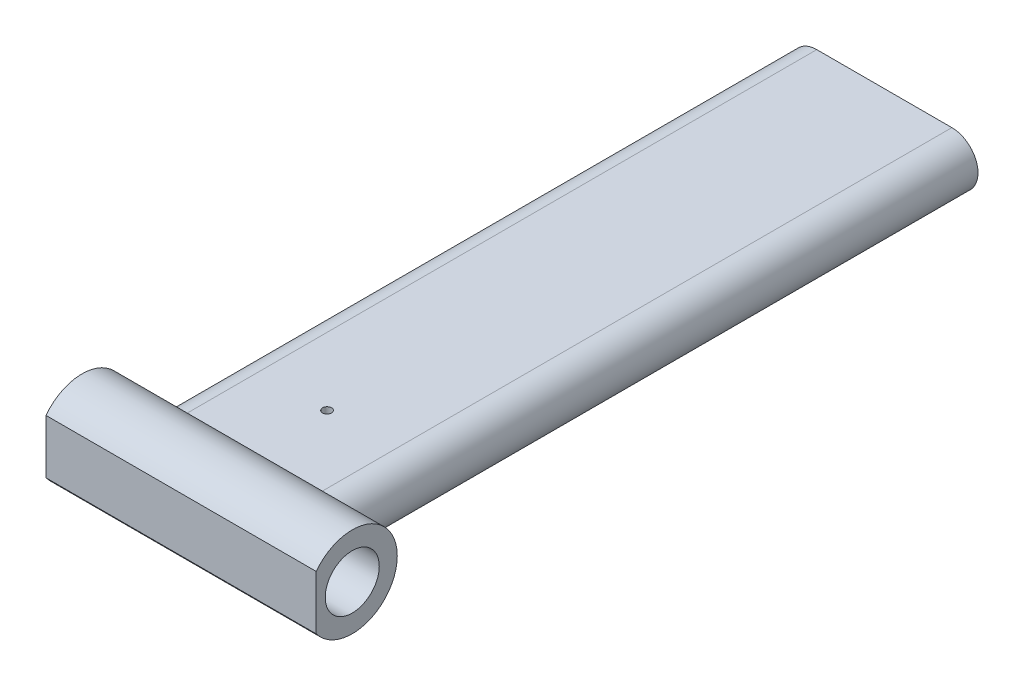
ISO-10303-21;
HEADER;
FILE_DESCRIPTION(('STEP AP214'),'2;1');
FILE_NAME('part.step','',(''),(''),'','','');
FILE_SCHEMA(('AUTOMOTIVE_DESIGN { 1 0 10303 214 1 1 1 1 }'));
ENDSEC;
DATA;
#1=APPLICATION_CONTEXT('core data for automotive mechanical design processes');
#2=APPLICATION_PROTOCOL_DEFINITION('international standard','automotive_design',2000,#1);
#3=PRODUCT_CONTEXT('',#1,'mechanical');
#4=PRODUCT('Part','Part','',(#3));
#5=PRODUCT_RELATED_PRODUCT_CATEGORY('part','',(#4));
#6=PRODUCT_DEFINITION_FORMATION('','',#4);
#7=PRODUCT_DEFINITION_CONTEXT('part definition',#1,'design');
#8=PRODUCT_DEFINITION('design','',#6,#7);
#9=PRODUCT_DEFINITION_SHAPE('','',#8);
#10=(LENGTH_UNIT() NAMED_UNIT(*) SI_UNIT(.MILLI.,.METRE.));
#11=(NAMED_UNIT(*) PLANE_ANGLE_UNIT() SI_UNIT($,.RADIAN.));
#12=(NAMED_UNIT(*) SI_UNIT($,.STERADIAN.) SOLID_ANGLE_UNIT());
#13=UNCERTAINTY_MEASURE_WITH_UNIT(LENGTH_MEASURE(1.E-05),#10,'distance_accuracy_value','');
#14=(GEOMETRIC_REPRESENTATION_CONTEXT(3) GLOBAL_UNCERTAINTY_ASSIGNED_CONTEXT((#13)) GLOBAL_UNIT_ASSIGNED_CONTEXT((#10,
#11,#12)) REPRESENTATION_CONTEXT('',''));
#15=CARTESIAN_POINT('',(0.,0.,0.));
#16=DIRECTION('',(0.,0.,1.));
#17=DIRECTION('',(1.,0.,0.));
#18=AXIS2_PLACEMENT_3D('',#15,#16,#17);
#19=CARTESIAN_POINT('',(7.5,0.,35.));
#20=DIRECTION('',(0.,0.,1.));
#21=DIRECTION('',(1.,0.,0.));
#22=AXIS2_PLACEMENT_3D('',#19,#20,#21);
#23=PLANE('',#22);
#24=CARTESIAN_POINT('',(7.5,0.,35.));
#25=DIRECTION('',(0.,0.,1.));
#26=DIRECTION('',(1.,0.,0.));
#27=AXIS2_PLACEMENT_3D('',#24,#25,#26);
#28=CIRCLE('',#27,2.9);
#29=CARTESIAN_POINT('',(7.5,-2.9,35.));
#30=VERTEX_POINT('',#29);
#31=CARTESIAN_POINT('',(7.79725742015153,-2.88472494809555,35.));
#32=VERTEX_POINT('',#31);
#33=EDGE_CURVE('E271',#30,#32,#28,.T.);
#34=ORIENTED_EDGE('',*,*,#33,.T.);
#35=DIRECTION('',(-1.,0.,0.));
#36=VECTOR('',#35,1.);
#37=CARTESIAN_POINT('',(15.,-2.88472494809555,35.));
#38=LINE('',#37,#36);
#39=CARTESIAN_POINT('',(-7.79725742015153,-2.88472494809555,35.));
#40=VERTEX_POINT('',#39);
#41=EDGE_CURVE('E246',#32,#40,#38,.T.);
#42=ORIENTED_EDGE('',*,*,#41,.T.);
#43=CARTESIAN_POINT('',(-7.5,0.,35.));
#44=DIRECTION('',(0.,0.,1.));
#45=DIRECTION('',(1.,0.,0.));
#46=AXIS2_PLACEMENT_3D('',#43,#44,#45);
#47=CIRCLE('',#46,2.9);
#48=CARTESIAN_POINT('',(-7.5,-2.9,35.));
#49=VERTEX_POINT('',#48);
#50=EDGE_CURVE('E274',#40,#49,#47,.T.);
#51=ORIENTED_EDGE('',*,*,#50,.T.);
#52=DIRECTION('',(1.,0.,0.));
#53=VECTOR('',#52,1.);
#54=CARTESIAN_POINT('',(7.5,-2.9,35.));
#55=LINE('',#54,#53);
#56=EDGE_CURVE('E278',#49,#30,#55,.T.);
#57=ORIENTED_EDGE('',*,*,#56,.T.);
#58=EDGE_LOOP('',(#34,#42,#51,#57));
#59=FACE_BOUND('',#58,.T.);
#60=ADVANCED_FACE('F45',(#59),#23,.T.);
#61=CARTESIAN_POINT('',(7.5,0.,35.));
#62=DIRECTION('',(0.,0.,-1.));
#63=DIRECTION('',(-1.,0.,0.));
#64=AXIS2_PLACEMENT_3D('',#61,#62,#63);
#65=CYLINDRICAL_SURFACE('',#64,2.9);
#66=CARTESIAN_POINT('',(4.6,0.,34.0731057036588));
#67=CARTESIAN_POINT('',(4.60000859308253,-0.149323091804453,34.0735696613463));
#68=CARTESIAN_POINT('',(4.61161208448263,-0.298860096263019,34.0807812520985));
#69=CARTESIAN_POINT('',(4.65743231106752,-0.59341131911271,34.1080544837705));
#70=CARTESIAN_POINT('',(4.69170343800221,-0.73841377807614,34.1281470293976));
#71=CARTESIAN_POINT('',(4.78096790044871,-1.01903846124212,34.1791637112473));
#72=CARTESIAN_POINT('',(4.83586172173789,-1.15470208796062,34.2100357814763));
#73=CARTESIAN_POINT('',(4.96421348664588,-1.41449664900542,34.2799751735939));
#74=CARTESIAN_POINT('',(5.03766707782475,-1.53863027790314,34.3190405737053));
#75=CARTESIAN_POINT('',(5.2071536046435,-1.78227073257131,34.405454431006));
#76=CARTESIAN_POINT('',(5.30445889076254,-1.90074810281223,34.453202702729));
#77=CARTESIAN_POINT('',(5.51605921210326,-2.12068586327357,34.5506742951925));
#78=CARTESIAN_POINT('',(5.63037486660659,-2.22212527860831,34.6003999584865));
#79=CARTESIAN_POINT('',(5.88802442749597,-2.41670612576128,34.7028574098811));
#80=CARTESIAN_POINT('',(6.03317778067608,-2.50761381092249,34.7552937335761));
#81=CARTESIAN_POINT('',(6.33980914612007,-2.66334380260292,34.8501264672196));
#82=CARTESIAN_POINT('',(6.50126075807103,-2.72820747359309,34.8925387534368));
#83=CARTESIAN_POINT('',(6.79781180542367,-2.81692280380674,34.9523022114851));
#84=CARTESIAN_POINT('',(6.93040213066588,-2.84678273734841,34.9731772039438));
#85=CARTESIAN_POINT('',(7.19978096175157,-2.887623827329,35.0019854849622));
#86=CARTESIAN_POINT('',(7.33656454603734,-2.89862631340679,35.0099333948113));
#87=CARTESIAN_POINT('',(7.6106131955965,-2.90113315244795,35.0117319576496));
#88=CARTESIAN_POINT('',(7.74787867760975,-2.89260756270609,35.0055609619157));
#89=CARTESIAN_POINT('',(8.01864881087647,-2.8565172094846,34.9800058670248));
#90=CARTESIAN_POINT('',(8.1521506996857,-2.82893882159934,34.96061231272));
#91=CARTESIAN_POINT('',(8.41128218757327,-2.75637030539624,34.9113681478763));
#92=CARTESIAN_POINT('',(8.53695549686073,-2.71148928659073,34.8815831747859));
#93=CARTESIAN_POINT('',(8.77935819558176,-2.60590583661322,34.8147601568606));
#94=CARTESIAN_POINT('',(8.89608419328327,-2.54519744363254,34.7777193802412));
#95=CARTESIAN_POINT('',(9.1379163955927,-2.39801121591817,34.693084445942));
#96=CARTESIAN_POINT('',(9.26118288440367,-2.30892590402053,34.6447599521899));
#97=CARTESIAN_POINT('',(9.49222166200274,-2.11283329227971,34.5472469850994));
#98=CARTESIAN_POINT('',(9.59997993110885,-2.00580996299756,34.4980577745555));
#99=CARTESIAN_POINT('',(9.81044288244475,-1.76095334873572,34.3971271056267));
#100=CARTESIAN_POINT('',(9.91087813830147,-1.6209471390896,34.3458212218614));
#101=CARTESIAN_POINT('',(10.0424625048596,-1.39763281877958,34.2762273174069));
#102=CARTESIAN_POINT('',(10.0831587243201,-1.32094282145287,34.2542492903374));
#103=CARTESIAN_POINT('',(10.1577590850894,-1.16356528508404,34.2133575928731));
#104=CARTESIAN_POINT('',(10.1916673594155,-1.08288021610812,34.1944420591496));
#105=CARTESIAN_POINT('',(10.2502322890893,-0.923549846415607,34.161383452438));
#106=CARTESIAN_POINT('',(10.275352795785,-0.845123101710534,34.1470073410511));
#107=CARTESIAN_POINT('',(10.3189228899643,-0.685915616006453,34.1218379082512));
#108=CARTESIAN_POINT('',(10.3373761224184,-0.605136187392592,34.1110426294776));
#109=CARTESIAN_POINT('',(10.36732992167,-0.441921100764522,34.0933535403335));
#110=CARTESIAN_POINT('',(10.3788348609093,-0.359486518131282,34.0864572765544));
#111=CARTESIAN_POINT('',(10.3947218868228,-0.193724542646152,34.0767608612005));
#112=CARTESIAN_POINT('',(10.3991048458465,-0.110397260397045,34.0739602079711));
#113=CARTESIAN_POINT('',(10.4012173306716,0.118561464705537,34.0720408513326));
#114=CARTESIAN_POINT('',(10.3915630507954,0.26438729636668,34.0772162645918));
#115=CARTESIAN_POINT('',(10.3507085599155,0.551894976747795,34.099865020829));
#116=CARTESIAN_POINT('',(10.3195083271729,0.693576821286534,34.1173383762149));
#117=CARTESIAN_POINT('',(10.2377140937705,0.966930344027687,34.1625583461787));
#118=CARTESIAN_POINT('',(10.1874356424124,1.09872517627305,34.1901375699809));
#119=CARTESIAN_POINT('',(10.0693310008068,1.35207152478134,34.2533261858201));
#120=CARTESIAN_POINT('',(10.0015008686782,1.47362073186866,34.2889373815035));
#121=CARTESIAN_POINT('',(9.84235756189763,1.71655782235697,34.3695034723072));
#122=CARTESIAN_POINT('',(9.74934371927057,1.83663552646443,34.4150432905971));
#123=CARTESIAN_POINT('',(9.54635082249472,2.06041572737082,34.5088566021297));
#124=CARTESIAN_POINT('',(9.43635237128592,2.16409922386101,34.5571331804538));
#125=CARTESIAN_POINT('',(9.18740375107453,2.36455461530603,34.6577823384035));
#126=CARTESIAN_POINT('',(9.04657185976775,2.45909716737563,34.7099729774203));
#127=CARTESIAN_POINT('',(8.74838632485985,2.6230489284415,34.8059323320956));
#128=CARTESIAN_POINT('',(8.59105326108224,2.69248897484832,34.8497113498865));
#129=CARTESIAN_POINT('',(8.29806452914012,2.79135747590465,34.9142254397461));
#130=CARTESIAN_POINT('',(8.16486302725833,2.82614242713288,34.9378760805921));
#131=CARTESIAN_POINT('',(7.89333593928654,2.87650740073892,34.9725564745115));
#132=CARTESIAN_POINT('',(7.75501673093741,2.89211054898593,34.983601424042));
#133=CARTESIAN_POINT('',(7.47680669164244,2.90325466827398,34.9914613874488));
#134=CARTESIAN_POINT('',(7.33691281874565,2.89874590173038,34.9882411230055));
#135=CARTESIAN_POINT('',(7.06019019556588,2.86983410127894,34.9679899895701));
#136=CARTESIAN_POINT('',(6.92336336761533,2.84541893014613,34.9509506949476));
#137=CARTESIAN_POINT('',(6.65993507684479,2.77890042271308,34.9060796916662));
#138=CARTESIAN_POINT('',(6.53316009294009,2.73727443958108,34.8785406933952));
#139=CARTESIAN_POINT('',(6.28814329364046,2.63797263209702,34.8157476691018));
#140=CARTESIAN_POINT('',(6.1699045723943,2.58029102446425,34.7804908640831));
#141=CARTESIAN_POINT('',(5.92600457920412,2.44033211735418,34.6996887317621));
#142=CARTESIAN_POINT('',(5.8019766806283,2.35564166254766,34.6533946075577));
#143=CARTESIAN_POINT('',(5.56868185880743,2.16850252184747,34.5592594983409));
#144=CARTESIAN_POINT('',(5.45942841512725,2.06603781144471,34.5114171494514));
#145=CARTESIAN_POINT('',(5.24393180244646,1.83002240631621,34.4120535492227));
#146=CARTESIAN_POINT('',(5.14004353301485,1.69414720640136,34.3608954867008));
#147=CARTESIAN_POINT('',(4.9567427563496,1.40399665629996,34.2673982419464));
#148=CARTESIAN_POINT('',(4.87731634428883,1.24973182874342,34.2250540541066));
#149=CARTESIAN_POINT('',(4.75823595220839,0.955637123511464,34.1604237047045));
#150=CARTESIAN_POINT('',(4.71401577797432,0.818137022695345,34.1359074405293));
#151=CARTESIAN_POINT('',(4.64646767603986,0.536799758690869,34.0983452460405));
#152=CARTESIAN_POINT('',(4.6230819863701,0.392981283197655,34.0852676048932));
#153=CARTESIAN_POINT('',(4.6070920960275,0.206903229121089,34.0765834204131));
#154=CARTESIAN_POINT('',(4.60443537743237,0.165587676294961,34.0751710744771));
#155=CARTESIAN_POINT('',(4.60088801885187,0.0828535813229103,34.0733677768442));
#156=CARTESIAN_POINT('',(4.59999761554228,0.0414350261196555,34.0729769620243));
#157=CARTESIAN_POINT('',(4.6,0.,34.0731057036588));
#158=B_SPLINE_CURVE_WITH_KNOTS('',3,(#66,#67,#68,#69,#70,#71,#72,#73,#74,#75,#76,#77,#78,#79,
#80,#81,#82,#83,#84,#85,#86,#87,#88,#89,#90,#91,#92,#93,#94,#95,#96,#97,#98,#99,#100,#101,#102,
#103,#104,#105,#106,#107,#108,#109,#110,#111,#112,#113,#114,#115,#116,#117,#118,#119,#120,#121,
#122,#123,#124,#125,#126,#127,#128,#129,#130,#131,#132,#133,#134,#135,#136,#137,#138,#139,#140,
#141,#142,#143,#144,#145,#146,#147,#148,#149,#150,#151,#152,#153,#154,#155,#156,#157),
.UNSPECIFIED.,.T.,.F.,(4,2,2,2,2,2,2,2,2,2,2,2,2,2,2,2,2,2,2,2,2,2,2,2,2,2,2,2,2,2,2,2,2,2,2,2,
2,2,2,2,2,2,2,2,2,4),(0.,0.447797326337698,0.896673074521697,1.3434100414022,1.79004234135358,
2.2698672717759,2.75027863741921,3.284988712723,3.81884614179468,4.22959035493267,
4.63986966836597,5.05077849055113,5.46198145278928,5.87063271908302,6.27943813789043,
6.75629776408863,7.23358580708956,7.76984532737279,8.03819660919938,8.30638399803649,
8.5568176549017,8.80711419284568,9.05725305890729,9.30736128391772,9.7436928637086,
10.1800248837377,10.6094341937915,11.0389400274693,11.5127538910793,11.9871129256802,
12.5169926913495,13.0462192912426,13.4635018058645,13.8802807434964,14.2980909630846,
14.7161561183234,15.1233304939298,15.5306517251004,16.0003097213041,16.4703933628746,
17.0033190929159,17.5359413310599,17.9736060524001,18.4100535724231,18.5342942909719,
18.6585516559173),.UNSPECIFIED.);
#159=CARTESIAN_POINT('',(7.5,2.9,34.9891673406904));
#160=VERTEX_POINT('',#159);
#161=EDGE_CURVE('E70',#32,#160,#158,.T.);
#162=ORIENTED_EDGE('',*,*,#161,.F.);
#163=ORIENTED_EDGE('',*,*,#33,.F.);
#164=DIRECTION('',(0.,0.,-1.));
#165=VECTOR('',#164,1.);
#166=CARTESIAN_POINT('',(7.5,-2.9,35.));
#167=LINE('',#166,#165);
#168=CARTESIAN_POINT('',(7.5,-2.9,-35.));
#169=VERTEX_POINT('',#168);
#170=EDGE_CURVE('E281',#30,#169,#167,.T.);
#171=ORIENTED_EDGE('',*,*,#170,.T.);
#172=CARTESIAN_POINT('',(7.5,0.,-35.));
#173=DIRECTION('',(0.,0.,1.));
#174=DIRECTION('',(1.,0.,0.));
#175=AXIS2_PLACEMENT_3D('',#172,#173,#174);
#176=CIRCLE('',#175,2.9);
#177=CARTESIAN_POINT('',(7.5,2.9,-35.));
#178=VERTEX_POINT('',#177);
#179=EDGE_CURVE('E232',#169,#178,#176,.T.);
#180=ORIENTED_EDGE('',*,*,#179,.T.);
#181=DIRECTION('',(0.,0.,-1.));
#182=VECTOR('',#181,1.);
#183=CARTESIAN_POINT('',(7.5,2.9,35.));
#184=LINE('',#183,#182);
#185=EDGE_CURVE('E303',#160,#178,#184,.T.);
#186=ORIENTED_EDGE('',*,*,#185,.F.);
#187=EDGE_LOOP('',(#162,#163,#171,#180,#186));
#188=FACE_BOUND('',#187,.T.);
#189=ADVANCED_FACE('F47',(#188),#65,.T.);
#190=CARTESIAN_POINT('',(7.5,2.9,35.));
#191=DIRECTION('',(0.,-1.,0.));
#192=DIRECTION('',(1.,0.,0.));
#193=AXIS2_PLACEMENT_3D('',#190,#191,#192);
#194=PLANE('',#193);
#195=CARTESIAN_POINT('',(0.,2.9,26.8701622728494));
#196=DIRECTION('',(0.,1.,0.));
#197=DIRECTION('',(-1.,0.,0.));
#198=AXIS2_PLACEMENT_3D('',#195,#196,#197);
#199=CIRCLE('',#198,0.5);
#200=CARTESIAN_POINT('',(-0.5,2.9,26.8701622728494));
#201=VERTEX_POINT('',#200);
#202=EDGE_CURVE('E367',#201,#201,#199,.T.);
#203=ORIENTED_EDGE('',*,*,#202,.F.);
#204=EDGE_LOOP('',(#203));
#205=FACE_BOUND('',#204,.T.);
#206=DIRECTION('',(-1.,0.,0.));
#207=VECTOR('',#206,1.);
#208=CARTESIAN_POINT('',(15.,2.9,34.9891673406904));
#209=LINE('',#208,#207);
#210=CARTESIAN_POINT('',(-7.5,2.9,34.9891673406904));
#211=VERTEX_POINT('',#210);
#212=EDGE_CURVE('E194',#160,#211,#209,.T.);
#213=ORIENTED_EDGE('',*,*,#212,.F.);
#214=ORIENTED_EDGE('',*,*,#185,.T.);
#215=DIRECTION('',(-1.,0.,0.));
#216=VECTOR('',#215,1.);
#217=CARTESIAN_POINT('',(7.5,2.9,-35.));
#218=LINE('',#217,#216);
#219=CARTESIAN_POINT('',(-7.5,2.9,-35.));
#220=VERTEX_POINT('',#219);
#221=EDGE_CURVE('E284',#178,#220,#218,.T.);
#222=ORIENTED_EDGE('',*,*,#221,.T.);
#223=DIRECTION('',(0.,0.,-1.));
#224=VECTOR('',#223,1.);
#225=CARTESIAN_POINT('',(-7.5,2.9,35.));
#226=LINE('',#225,#224);
#227=EDGE_CURVE('E300',#211,#220,#226,.T.);
#228=ORIENTED_EDGE('',*,*,#227,.F.);
#229=EDGE_LOOP('',(#213,#214,#222,#228));
#230=FACE_BOUND('',#229,.T.);
#231=ADVANCED_FACE('F200',(#205,#230),#194,.F.);
#232=CARTESIAN_POINT('',(-7.5,0.,35.));
#233=DIRECTION('',(0.,0.,-1.));
#234=DIRECTION('',(-1.,0.,0.));
#235=AXIS2_PLACEMENT_3D('',#232,#233,#234);
#236=CYLINDRICAL_SURFACE('',#235,2.9);
#237=CARTESIAN_POINT('',(-10.4,0.,34.0731057036588));
#238=CARTESIAN_POINT('',(-10.3999914069175,-0.149323091804453,34.0735696613463));
#239=CARTESIAN_POINT('',(-10.3883879155174,-0.298860096263019,34.0807812520985));
#240=CARTESIAN_POINT('',(-10.3425676889325,-0.593411319112711,34.1080544837705));
#241=CARTESIAN_POINT('',(-10.3082965619978,-0.73841377807614,34.1281470293976));
#242=CARTESIAN_POINT('',(-10.2190320995513,-1.01903846124212,34.1791637112473));
#243=CARTESIAN_POINT('',(-10.1641382782621,-1.15470208796062,34.2100357814763));
#244=CARTESIAN_POINT('',(-10.0357865133541,-1.41449664900542,34.2799751735939));
#245=CARTESIAN_POINT('',(-9.96233292217525,-1.53863027790314,34.3190405737053));
#246=CARTESIAN_POINT('',(-9.7928463953565,-1.78227073257131,34.405454431006));
#247=CARTESIAN_POINT('',(-9.69554110923746,-1.90074810281223,34.453202702729));
#248=CARTESIAN_POINT('',(-9.48394078789674,-2.12068586327357,34.5506742951925));
#249=CARTESIAN_POINT('',(-9.36962513339341,-2.22212527860831,34.6003999584865));
#250=CARTESIAN_POINT('',(-9.11197557250403,-2.41670612576128,34.7028574098811));
#251=CARTESIAN_POINT('',(-8.96682221932392,-2.50761381092249,34.7552937335761));
#252=CARTESIAN_POINT('',(-8.66019085387994,-2.66334380260292,34.8501264672196));
#253=CARTESIAN_POINT('',(-8.49873924192897,-2.72820747359309,34.8925387534368));
#254=CARTESIAN_POINT('',(-8.20218819457633,-2.81692280380674,34.9523022114851));
#255=CARTESIAN_POINT('',(-8.06959786933412,-2.84678273734841,34.9731772039438));
#256=CARTESIAN_POINT('',(-7.80021903824844,-2.887623827329,35.0019854849622));
#257=CARTESIAN_POINT('',(-7.66343545396267,-2.89862631340679,35.0099333948113));
#258=CARTESIAN_POINT('',(-7.3893868044035,-2.90113315244795,35.0117319576496));
#259=CARTESIAN_POINT('',(-7.25212132239025,-2.89260756270609,35.0055609619157));
#260=CARTESIAN_POINT('',(-6.98135118912353,-2.8565172094846,34.9800058670248));
#261=CARTESIAN_POINT('',(-6.8478493003143,-2.82893882159934,34.96061231272));
#262=CARTESIAN_POINT('',(-6.58871781242673,-2.75637030539624,34.9113681478763));
#263=CARTESIAN_POINT('',(-6.46304450313927,-2.71148928659073,34.8815831747859));
#264=CARTESIAN_POINT('',(-6.22064180441823,-2.60590583661322,34.8147601568606));
#265=CARTESIAN_POINT('',(-6.10391580671674,-2.54519744363254,34.7777193802412));
#266=CARTESIAN_POINT('',(-5.8620836044073,-2.39801121591817,34.693084445942));
#267=CARTESIAN_POINT('',(-5.73881711559633,-2.30892590402053,34.6447599521899));
#268=CARTESIAN_POINT('',(-5.50777833799726,-2.11283329227971,34.5472469850994));
#269=CARTESIAN_POINT('',(-5.40002006889115,-2.00580996299757,34.4980577745555));
#270=CARTESIAN_POINT('',(-5.18955711755525,-1.76095334873572,34.3971271056267));
#271=CARTESIAN_POINT('',(-5.08912186169853,-1.62094713908961,34.3458212218614));
#272=CARTESIAN_POINT('',(-4.9575374951404,-1.39763281877959,34.2762273174069));
#273=CARTESIAN_POINT('',(-4.91684127567995,-1.32094282145288,34.2542492903374));
#274=CARTESIAN_POINT('',(-4.84224091491061,-1.16356528508405,34.2133575928731));
#275=CARTESIAN_POINT('',(-4.80833264058451,-1.08288021610812,34.1944420591496));
#276=CARTESIAN_POINT('',(-4.74976771091067,-0.923549846415608,34.161383452438));
#277=CARTESIAN_POINT('',(-4.72464720421496,-0.845123101710536,34.1470073410511));
#278=CARTESIAN_POINT('',(-4.6810771100357,-0.685915616006455,34.1218379082512));
#279=CARTESIAN_POINT('',(-4.66262387758163,-0.605136187392594,34.1110426294776));
#280=CARTESIAN_POINT('',(-4.63267007833,-0.441921100764525,34.0933535403335));
#281=CARTESIAN_POINT('',(-4.62116513909068,-0.359486518131284,34.0864572765544));
#282=CARTESIAN_POINT('',(-4.60527811317716,-0.193724542646153,34.0767608612005));
#283=CARTESIAN_POINT('',(-4.60089515415349,-0.110397260397046,34.0739602079711));
#284=CARTESIAN_POINT('',(-4.59878266932838,0.118561464705537,34.0720408513326));
#285=CARTESIAN_POINT('',(-4.6084369492046,0.26438729636668,34.0772162645918));
#286=CARTESIAN_POINT('',(-4.64929144008455,0.551894976747796,34.099865020829));
#287=CARTESIAN_POINT('',(-4.6804916728271,0.693576821286534,34.1173383762149));
#288=CARTESIAN_POINT('',(-4.76228590622953,0.966930344027686,34.1625583461787));
#289=CARTESIAN_POINT('',(-4.81256435758761,1.09872517627305,34.1901375699809));
#290=CARTESIAN_POINT('',(-4.93066899919318,1.35207152478134,34.2533261858201));
#291=CARTESIAN_POINT('',(-4.99849913132183,1.47362073186866,34.2889373815035));
#292=CARTESIAN_POINT('',(-5.15764243810237,1.71655782235697,34.3695034723072));
#293=CARTESIAN_POINT('',(-5.25065628072943,1.83663552646442,34.4150432905971));
#294=CARTESIAN_POINT('',(-5.45364917750528,2.06041572737082,34.5088566021297));
#295=CARTESIAN_POINT('',(-5.56364762871408,2.16409922386101,34.5571331804538));
#296=CARTESIAN_POINT('',(-5.81259624892547,2.36455461530603,34.6577823384035));
#297=CARTESIAN_POINT('',(-5.95342814023225,2.45909716737563,34.7099729774203));
#298=CARTESIAN_POINT('',(-6.25161367514015,2.6230489284415,34.8059323320956));
#299=CARTESIAN_POINT('',(-6.40894673891776,2.69248897484832,34.8497113498865));
#300=CARTESIAN_POINT('',(-6.70193547085988,2.79135747590465,34.9142254397461));
#301=CARTESIAN_POINT('',(-6.83513697274167,2.82614242713288,34.9378760805921));
#302=CARTESIAN_POINT('',(-7.10666406071346,2.87650740073892,34.9725564745115));
#303=CARTESIAN_POINT('',(-7.24498326906259,2.89211054898593,34.983601424042));
#304=CARTESIAN_POINT('',(-7.52319330835756,2.90325466827398,34.9914613874488));
#305=CARTESIAN_POINT('',(-7.66308718125435,2.89874590173038,34.9882411230055));
#306=CARTESIAN_POINT('',(-7.93980980443412,2.86983410127894,34.9679899895701));
#307=CARTESIAN_POINT('',(-8.07663663238467,2.84541893014613,34.9509506949476));
#308=CARTESIAN_POINT('',(-8.34006492315521,2.77890042271308,34.9060796916662));
#309=CARTESIAN_POINT('',(-8.46683990705991,2.73727443958108,34.8785406933952));
#310=CARTESIAN_POINT('',(-8.71185670635953,2.63797263209702,34.8157476691018));
#311=CARTESIAN_POINT('',(-8.83009542760569,2.58029102446425,34.7804908640831));
#312=CARTESIAN_POINT('',(-9.07399542079587,2.44033211735418,34.6996887317621));
#313=CARTESIAN_POINT('',(-9.1980233193717,2.35564166254766,34.6533946075577));
#314=CARTESIAN_POINT('',(-9.43131814119258,2.16850252184747,34.5592594983409));
#315=CARTESIAN_POINT('',(-9.54057158487275,2.06603781144471,34.5114171494514));
#316=CARTESIAN_POINT('',(-9.75606819755354,1.83002240631622,34.4120535492227));
#317=CARTESIAN_POINT('',(-9.85995646698515,1.69414720640136,34.3608954867008));
#318=CARTESIAN_POINT('',(-10.0432572436504,1.40399665629996,34.2673982419464));
#319=CARTESIAN_POINT('',(-10.1226836557112,1.24973182874342,34.2250540541066));
#320=CARTESIAN_POINT('',(-10.2417640477916,0.955637123511467,34.1604237047045));
#321=CARTESIAN_POINT('',(-10.2859842220257,0.818137022695348,34.1359074405293));
#322=CARTESIAN_POINT('',(-10.3535323239601,0.536799758690872,34.0983452460405));
#323=CARTESIAN_POINT('',(-10.3769180136299,0.392981283197659,34.0852676048932));
#324=CARTESIAN_POINT('',(-10.3929079039725,0.206903229121093,34.0765834204131));
#325=CARTESIAN_POINT('',(-10.3955646225676,0.165587676294965,34.0751710744771));
#326=CARTESIAN_POINT('',(-10.3991119811481,0.0828535813229129,34.0733677768442));
#327=CARTESIAN_POINT('',(-10.4000023844577,0.0414350261196569,34.0729769620243));
#328=CARTESIAN_POINT('',(-10.4,0.,34.0731057036588));
#329=B_SPLINE_CURVE_WITH_KNOTS('',3,(#237,#238,#239,#240,#241,#242,#243,#244,#245,#246,#247,
#248,#249,#250,#251,#252,#253,#254,#255,#256,#257,#258,#259,#260,#261,#262,#263,#264,#265,#266,
#267,#268,#269,#270,#271,#272,#273,#274,#275,#276,#277,#278,#279,#280,#281,#282,#283,#284,#285,
#286,#287,#288,#289,#290,#291,#292,#293,#294,#295,#296,#297,#298,#299,#300,#301,#302,#303,#304,
#305,#306,#307,#308,#309,#310,#311,#312,#313,#314,#315,#316,#317,#318,#319,#320,#321,#322,#323,
#324,#325,#326,#327,#328),.UNSPECIFIED.,.T.,.F.,(4,2,2,2,2,2,2,2,2,2,2,2,2,2,2,2,2,2,2,2,2,2,2,
2,2,2,2,2,2,2,2,2,2,2,2,2,2,2,2,2,2,2,2,2,2,4),(0.,0.447797326337698,0.896673074521697,
1.34341004140219,1.79004234135358,2.2698672717759,2.75027863741921,3.284988712723,
3.81884614179468,4.22959035493267,4.63986966836597,5.05077849055113,5.46198145278927,
5.87063271908302,6.27943813789043,6.75629776408863,7.23358580708956,7.76984532737279,
8.03819660919937,8.30638399803649,8.5568176549017,8.80711419284568,9.05725305890729,
9.30736128391771,9.7436928637086,10.1800248837377,10.6094341937915,11.0389400274693,
11.5127538910793,11.9871129256802,12.5169926913495,13.0462192912426,13.4635018058645,
13.8802807434964,14.2980909630846,14.7161561183234,15.1233304939298,15.5306517251004,
16.0003097213041,16.4703933628746,17.0033190929159,17.5359413310598,17.9736060524001,
18.410053572423,18.5342942909719,18.6585516559173),.UNSPECIFIED.);
#330=EDGE_CURVE('E186',#211,#40,#329,.T.);
#331=ORIENTED_EDGE('',*,*,#330,.F.);
#332=ORIENTED_EDGE('',*,*,#227,.T.);
#333=CARTESIAN_POINT('',(-7.5,0.,-35.));
#334=DIRECTION('',(0.,0.,1.));
#335=DIRECTION('',(1.,0.,0.));
#336=AXIS2_PLACEMENT_3D('',#333,#334,#335);
#337=CIRCLE('',#336,2.9);
#338=CARTESIAN_POINT('',(-7.5,-2.9,-35.));
#339=VERTEX_POINT('',#338);
#340=EDGE_CURVE('E288',#220,#339,#337,.T.);
#341=ORIENTED_EDGE('',*,*,#340,.T.);
#342=DIRECTION('',(0.,0.,-1.));
#343=VECTOR('',#342,1.);
#344=CARTESIAN_POINT('',(-7.5,-2.9,35.));
#345=LINE('',#344,#343);
#346=EDGE_CURVE('E296',#49,#339,#345,.T.);
#347=ORIENTED_EDGE('',*,*,#346,.F.);
#348=ORIENTED_EDGE('',*,*,#50,.F.);
#349=EDGE_LOOP('',(#331,#332,#341,#347,#348));
#350=FACE_BOUND('',#349,.T.);
#351=ADVANCED_FACE('F195',(#350),#236,.T.);
#352=CARTESIAN_POINT('',(7.5,0.,35.));
#353=DIRECTION('',(0.,0.,-1.));
#354=DIRECTION('',(-1.,0.,0.));
#355=AXIS2_PLACEMENT_3D('',#352,#353,#354);
#356=CYLINDRICAL_SURFACE('',#355,1.9);
#357=DIRECTION('',(0.,0.,-1.));
#358=VECTOR('',#357,1.);
#359=CARTESIAN_POINT('',(7.5,-1.9,35.));
#360=LINE('',#359,#358);
#361=CARTESIAN_POINT('',(7.5,-1.9,34.4544547093855));
#362=VERTEX_POINT('',#361);
#363=CARTESIAN_POINT('',(7.5,-1.9,-35.));
#364=VERTEX_POINT('',#363);
#365=EDGE_CURVE('E259',#362,#364,#360,.T.);
#366=ORIENTED_EDGE('',*,*,#365,.F.);
#367=CARTESIAN_POINT('',(5.6,0.,34.0731057036588));
#368=CARTESIAN_POINT('',(5.59999592598985,-0.102867070264451,34.0734168956019));
#369=CARTESIAN_POINT('',(5.60837994721177,-0.205696668751725,34.0769361105814));
#370=CARTESIAN_POINT('',(5.64154527936848,-0.408257071486904,34.0900195043593));
#371=CARTESIAN_POINT('',(5.66632390305004,-0.507988380773688,34.0995826924736));
#372=CARTESIAN_POINT('',(5.73126389382428,-0.701402512188467,34.12375249778));
#373=CARTESIAN_POINT('',(5.77139462634517,-0.795096948400307,34.1383490653646));
#374=CARTESIAN_POINT('',(5.86574160069643,-0.974407854696053,34.1711596216486));
#375=CARTESIAN_POINT('',(5.91996171739593,-1.06002209371655,34.1893746051613));
#376=CARTESIAN_POINT('',(6.04343847300517,-1.22450797290557,34.2284596005888));
#377=CARTESIAN_POINT('',(6.11320606878204,-1.30297767368042,34.2494062481296));
#378=CARTESIAN_POINT('',(6.26471337187252,-1.44742112346305,34.2912224222745));
#379=CARTESIAN_POINT('',(6.34645690954783,-1.51339085896715,34.312091922006));
#380=CARTESIAN_POINT('',(6.52350025783369,-1.63350188404337,34.352308027886));
#381=CARTESIAN_POINT('',(6.61920522843817,-1.68707963631558,34.3715631481311));
#382=CARTESIAN_POINT('',(6.81912585928198,-1.77719376789458,34.4051721208582));
#383=CARTESIAN_POINT('',(6.92333788671393,-1.8137373770959,34.4195280520356));
#384=CARTESIAN_POINT('',(7.13260687203539,-1.86712970928307,34.440874294756));
#385=CARTESIAN_POINT('',(7.23743399720057,-1.88475911338819,34.448155291331));
#386=CARTESIAN_POINT('',(7.4487921906245,-1.9022642564986,34.4553835916863));
#387=CARTESIAN_POINT('',(7.55532250110788,-1.90214768263981,34.4553340708728));
#388=CARTESIAN_POINT('',(7.75995901174348,-1.88475610073097,34.4481552970382));
#389=CARTESIAN_POINT('',(7.85817501473964,-1.86855594609757,34.4414695442741));
#390=CARTESIAN_POINT('',(8.05037058659449,-1.82123332857503,34.4225039188628));
#391=CARTESIAN_POINT('',(8.14434948905713,-1.79010852728555,34.4102231696039));
#392=CARTESIAN_POINT('',(8.32757507396913,-1.7132387269383,34.3811796994723));
#393=CARTESIAN_POINT('',(8.41669248966879,-1.66721847288127,34.3643336538807));
#394=CARTESIAN_POINT('',(8.58624630573543,-1.56205949396065,34.3280741127119));
#395=CARTESIAN_POINT('',(8.66667961135366,-1.50291611520986,34.3086597072994));
#396=CARTESIAN_POINT('',(8.82253293724827,-1.36829780537543,34.2677721742478));
#397=CARTESIAN_POINT('',(8.89720264199844,-1.29196687496481,34.2462502815131));
#398=CARTESIAN_POINT('',(9.0329083388819,-1.1276301245627,34.2047208484872));
#399=CARTESIAN_POINT('',(9.09394201925977,-1.03962232898268,34.1847135653518));
#400=CARTESIAN_POINT('',(9.20154115792272,-0.852411964134541,34.1480077741745));
#401=CARTESIAN_POINT('',(9.24784041466746,-0.753043230260171,34.1313719252012));
#402=CARTESIAN_POINT('',(9.3228092364225,-0.547134096635731,34.103730081943));
#403=CARTESIAN_POINT('',(9.35148686724363,-0.44059700281675,34.0927215123154));
#404=CARTESIAN_POINT('',(9.38894967303257,-0.229604591715354,34.0780243612037));
#405=CARTESIAN_POINT('',(9.39873319692474,-0.125351912724076,34.0739697612977));
#406=CARTESIAN_POINT('',(9.40103499623982,0.0833795282560834,34.0724579592857));
#407=CARTESIAN_POINT('',(9.39355732523672,0.187858231409404,34.0749992082452));
#408=CARTESIAN_POINT('',(9.36230754570659,0.389633120314348,34.0861331615935));
#409=CARTESIAN_POINT('',(9.33920814503955,0.487048787497886,34.0944764220044));
#410=CARTESIAN_POINT('',(9.27825193795108,0.676558770504562,34.1160866365027));
#411=CARTESIAN_POINT('',(9.24039326338827,0.768652411002085,34.1293542138708));
#412=CARTESIAN_POINT('',(9.14981467398002,0.947884341645435,34.1599623466211));
#413=CARTESIAN_POINT('',(9.09669793292371,1.03480335028203,34.1774092575556));
#414=CARTESIAN_POINT('',(8.97755749583013,1.19879320337569,34.2144443169035));
#415=CARTESIAN_POINT('',(8.91152899797416,1.27586036629238,34.23403326073));
#416=CARTESIAN_POINT('',(8.76384027367488,1.4227383180198,34.2746247231872));
#417=CARTESIAN_POINT('',(8.68148559533613,1.49184847240942,34.2956422198722));
#418=CARTESIAN_POINT('',(8.50595439759194,1.61541821670338,34.3355966127186));
#419=CARTESIAN_POINT('',(8.41277674481963,1.66987627027621,34.3545332905747));
#420=CARTESIAN_POINT('',(8.21730743620714,1.76273583471071,34.3881228309412));
#421=CARTESIAN_POINT('',(8.11496680289337,1.80104394000969,34.4027506297128));
#422=CARTESIAN_POINT('',(7.90458116606439,1.85962839704548,34.425570340706));
#423=CARTESIAN_POINT('',(7.79653979066368,1.87991607429027,34.4337662948461));
#424=CARTESIAN_POINT('',(7.5853339594008,1.90085393998942,34.4422392435681));
#425=CARTESIAN_POINT('',(7.48230506972735,1.90268756150499,34.4429934043878));
#426=CARTESIAN_POINT('',(7.27748705963495,1.88971275748187,34.4377256946305));
#427=CARTESIAN_POINT('',(7.17569781681509,1.87490598868049,34.4317044986161));
#428=CARTESIAN_POINT('',(6.97953188943436,1.8300060355676,34.4139728373105));
#429=CARTESIAN_POINT('',(6.8850224976977,1.80041258216303,34.4024488744052));
#430=CARTESIAN_POINT('',(6.70225726105071,1.72722423630902,34.3751308882748));
#431=CARTESIAN_POINT('',(6.61400301519713,1.6836257792858,34.3593357781132));
#432=CARTESIAN_POINT('',(6.44119904901689,1.58100093929331,34.324231263042));
#433=CARTESIAN_POINT('',(6.35708900972967,1.52128313608297,34.3047806156246));
#434=CARTESIAN_POINT('',(6.19970287307963,1.38916942326993,34.265050702344));
#435=CARTESIAN_POINT('',(6.12643022733812,1.31676949048054,34.2447711751027));
#436=CARTESIAN_POINT('',(5.98869230377853,1.15659119827481,34.2043479123387));
#437=CARTESIAN_POINT('',(5.92493186007645,1.06818657240182,34.1842728196907));
#438=CARTESIAN_POINT('',(5.81318651638936,0.881205197858639,34.147716120839));
#439=CARTESIAN_POINT('',(5.7652033685459,0.782627320998053,34.1312349138212));
#440=CARTESIAN_POINT('',(5.68465521234039,0.572558274347403,34.1030496898348));
#441=CARTESIAN_POINT('',(5.65303641254696,0.460660302950911,34.0916433341567));
#442=CARTESIAN_POINT('',(5.61071658475905,0.232490728259829,34.0764975528324));
#443=CARTESIAN_POINT('',(5.60000460290506,0.116221447823112,34.0727541122496));
#444=CARTESIAN_POINT('',(5.6,0.,34.0731057036588));
#445=B_SPLINE_CURVE_WITH_KNOTS('',3,(#367,#368,#369,#370,#371,#372,#373,#374,#375,#376,#377,
#378,#379,#380,#381,#382,#383,#384,#385,#386,#387,#388,#389,#390,#391,#392,#393,#394,#395,#396,
#397,#398,#399,#400,#401,#402,#403,#404,#405,#406,#407,#408,#409,#410,#411,#412,#413,#414,#415,
#416,#417,#418,#419,#420,#421,#422,#423,#424,#425,#426,#427,#428,#429,#430,#431,#432,#433,#434,
#435,#436,#437,#438,#439,#440,#441,#442,#443,#444),.UNSPECIFIED.,.T.,.F.,(4,2,2,2,2,2,2,2,2,2,2,
2,2,2,2,2,2,2,2,2,2,2,2,2,2,2,2,2,2,2,2,2,2,2,2,2,2,2,4),(0.,0.308173142361392,
0.616295784310695,0.923806759172956,1.23140239552213,1.55119418243406,1.8710884751215,
2.203494210066,2.53575873147238,2.85370836938362,3.17152027945987,3.46943200785789,
3.76739042845873,4.0712034228619,4.37512433193323,4.70041782414355,5.02576642254189,
5.35669710970085,5.68747620945643,6.00023988557048,6.31293012055119,6.61294681901305,
6.91300150414568,7.22170306465517,7.53051964884147,7.85763635085325,8.18478733900762,
8.51380532259133,8.84261637780738,9.15019561016197,9.45774422227027,9.75553838083384,
10.0534083945328,10.3669611502157,10.6806135558364,11.0114941342077,11.3424114459941,
11.690774717986,12.0389554204534),.UNSPECIFIED.);
#446=CARTESIAN_POINT('',(7.5,1.9,34.4419041331098));
#447=VERTEX_POINT('',#446);
#448=EDGE_CURVE('E180',#362,#447,#445,.T.);
#449=ORIENTED_EDGE('',*,*,#448,.T.);
#450=DIRECTION('',(0.,0.,-1.));
#451=VECTOR('',#450,1.);
#452=CARTESIAN_POINT('',(7.5,1.9,35.));
#453=LINE('',#452,#451);
#454=CARTESIAN_POINT('',(7.5,1.9,-35.));
#455=VERTEX_POINT('',#454);
#456=EDGE_CURVE('E268',#447,#455,#453,.T.);
#457=ORIENTED_EDGE('',*,*,#456,.T.);
#458=CARTESIAN_POINT('',(7.5,0.,-35.));
#459=DIRECTION('',(0.,0.,1.));
#460=DIRECTION('',(1.,0.,0.));
#461=AXIS2_PLACEMENT_3D('',#458,#459,#460);
#462=CIRCLE('',#461,1.9);
#463=EDGE_CURVE('E237',#364,#455,#462,.T.);
#464=ORIENTED_EDGE('',*,*,#463,.F.);
#465=EDGE_LOOP('',(#366,#449,#457,#464));
#466=FACE_BOUND('',#465,.T.);
#467=ADVANCED_FACE('F199',(#466),#356,.F.);
#468=CARTESIAN_POINT('',(7.5,1.9,35.));
#469=DIRECTION('',(0.,-1.,0.));
#470=DIRECTION('',(0.,0.,-1.));
#471=AXIS2_PLACEMENT_3D('',#468,#469,#470);
#472=PLANE('',#471);
#473=CARTESIAN_POINT('',(0.,1.9,26.8701622728494));
#474=DIRECTION('',(0.,-1.,0.));
#475=DIRECTION('',(0.,0.,-1.));
#476=AXIS2_PLACEMENT_3D('',#473,#474,#475);
#477=CIRCLE('',#476,0.5);
#478=CARTESIAN_POINT('',(0.,1.9,26.3701622728494));
#479=VERTEX_POINT('',#478);
#480=EDGE_CURVE('E377',#479,#479,#477,.T.);
#481=ORIENTED_EDGE('',*,*,#480,.F.);
#482=EDGE_LOOP('',(#481));
#483=FACE_BOUND('',#482,.T.);
#484=ORIENTED_EDGE('',*,*,#456,.F.);
#485=DIRECTION('',(-1.,0.,0.));
#486=VECTOR('',#485,1.);
#487=CARTESIAN_POINT('',(15.,1.9,34.4419041331098));
#488=LINE('',#487,#486);
#489=CARTESIAN_POINT('',(-7.5,1.9,34.4419041331098));
#490=VERTEX_POINT('',#489);
#491=EDGE_CURVE('E162',#447,#490,#488,.T.);
#492=ORIENTED_EDGE('',*,*,#491,.T.);
#493=DIRECTION('',(0.,0.,-1.));
#494=VECTOR('',#493,1.);
#495=CARTESIAN_POINT('',(-7.5,1.9,35.));
#496=LINE('',#495,#494);
#497=CARTESIAN_POINT('',(-7.5,1.9,-35.));
#498=VERTEX_POINT('',#497);
#499=EDGE_CURVE('E265',#490,#498,#496,.T.);
#500=ORIENTED_EDGE('',*,*,#499,.T.);
#501=DIRECTION('',(-1.,0.,0.));
#502=VECTOR('',#501,1.);
#503=CARTESIAN_POINT('',(7.5,1.9,-35.));
#504=LINE('',#503,#502);
#505=EDGE_CURVE('E240',#455,#498,#504,.T.);
#506=ORIENTED_EDGE('',*,*,#505,.F.);
#507=EDGE_LOOP('',(#484,#492,#500,#506));
#508=FACE_BOUND('',#507,.T.);
#509=ADVANCED_FACE('F315',(#483,#508),#472,.T.);
#510=CARTESIAN_POINT('',(-7.5,0.,35.));
#511=DIRECTION('',(0.,0.,-1.));
#512=DIRECTION('',(-1.,0.,0.));
#513=AXIS2_PLACEMENT_3D('',#510,#511,#512);
#514=CYLINDRICAL_SURFACE('',#513,1.9);
#515=ORIENTED_EDGE('',*,*,#499,.F.);
#516=CARTESIAN_POINT('',(-9.4,0.,34.0731057036588));
#517=CARTESIAN_POINT('',(-9.40000407401015,-0.102867070264451,34.0734168956019));
#518=CARTESIAN_POINT('',(-9.39162005278823,-0.205696668751725,34.0769361105814));
#519=CARTESIAN_POINT('',(-9.35845472063152,-0.408257071486904,34.0900195043593));
#520=CARTESIAN_POINT('',(-9.33367609694996,-0.507988380773688,34.0995826924736));
#521=CARTESIAN_POINT('',(-9.26873610617572,-0.701402512188468,34.12375249778));
#522=CARTESIAN_POINT('',(-9.22860537365483,-0.795096948400307,34.1383490653646));
#523=CARTESIAN_POINT('',(-9.13425839930357,-0.974407854696053,34.1711596216486));
#524=CARTESIAN_POINT('',(-9.08003828260407,-1.06002209371655,34.1893746051613));
#525=CARTESIAN_POINT('',(-8.95656152699483,-1.22450797290557,34.2284596005888));
#526=CARTESIAN_POINT('',(-8.88679393121796,-1.30297767368042,34.2494062481296));
#527=CARTESIAN_POINT('',(-8.73528662812749,-1.44742112346305,34.2912224222745));
#528=CARTESIAN_POINT('',(-8.65354309045217,-1.51339085896715,34.312091922006));
#529=CARTESIAN_POINT('',(-8.47649974216631,-1.63350188404337,34.352308027886));
#530=CARTESIAN_POINT('',(-8.38079477156184,-1.68707963631558,34.3715631481311));
#531=CARTESIAN_POINT('',(-8.18087414071802,-1.77719376789458,34.4051721208582));
#532=CARTESIAN_POINT('',(-8.07666211328607,-1.8137373770959,34.4195280520356));
#533=CARTESIAN_POINT('',(-7.86739312796461,-1.86712970928307,34.440874294756));
#534=CARTESIAN_POINT('',(-7.76256600279944,-1.88475911338819,34.448155291331));
#535=CARTESIAN_POINT('',(-7.5512078093755,-1.9022642564986,34.4553835916863));
#536=CARTESIAN_POINT('',(-7.44467749889212,-1.90214768263981,34.4553340708728));
#537=CARTESIAN_POINT('',(-7.24004098825652,-1.88475610073097,34.4481552970382));
#538=CARTESIAN_POINT('',(-7.14182498526036,-1.86855594609757,34.4414695442741));
#539=CARTESIAN_POINT('',(-6.94962941340551,-1.82123332857504,34.4225039188628));
#540=CARTESIAN_POINT('',(-6.85565051094288,-1.79010852728555,34.4102231696039));
#541=CARTESIAN_POINT('',(-6.67242492603087,-1.7132387269383,34.3811796994723));
#542=CARTESIAN_POINT('',(-6.58330751033121,-1.66721847288127,34.3643336538807));
#543=CARTESIAN_POINT('',(-6.41375369426457,-1.56205949396065,34.3280741127119));
#544=CARTESIAN_POINT('',(-6.33332038864634,-1.50291611520986,34.3086597072994));
#545=CARTESIAN_POINT('',(-6.17746706275173,-1.36829780537543,34.2677721742478));
#546=CARTESIAN_POINT('',(-6.10279735800156,-1.29196687496481,34.2462502815131));
#547=CARTESIAN_POINT('',(-5.9670916611181,-1.1276301245627,34.2047208484872));
#548=CARTESIAN_POINT('',(-5.90605798074023,-1.03962232898268,34.1847135653518));
#549=CARTESIAN_POINT('',(-5.79845884207728,-0.852411964134541,34.1480077741745));
#550=CARTESIAN_POINT('',(-5.75215958533254,-0.753043230260171,34.1313719252012));
#551=CARTESIAN_POINT('',(-5.6771907635775,-0.547134096635731,34.103730081943));
#552=CARTESIAN_POINT('',(-5.64851313275637,-0.44059700281675,34.0927215123154));
#553=CARTESIAN_POINT('',(-5.61105032696743,-0.229604591715354,34.0780243612037));
#554=CARTESIAN_POINT('',(-5.60126680307526,-0.125351912724076,34.0739697612977));
#555=CARTESIAN_POINT('',(-5.59896500376018,0.0833795282560834,34.0724579592857));
#556=CARTESIAN_POINT('',(-5.60644267476328,0.187858231409404,34.0749992082452));
#557=CARTESIAN_POINT('',(-5.63769245429341,0.389633120314348,34.0861331615935));
#558=CARTESIAN_POINT('',(-5.66079185496045,0.487048787497887,34.0944764220044));
#559=CARTESIAN_POINT('',(-5.72174806204892,0.676558770504563,34.1160866365027));
#560=CARTESIAN_POINT('',(-5.75960673661173,0.768652411002086,34.1293542138708));
#561=CARTESIAN_POINT('',(-5.85018532601998,0.947884341645435,34.1599623466211));
#562=CARTESIAN_POINT('',(-5.90330206707629,1.03480335028203,34.1774092575556));
#563=CARTESIAN_POINT('',(-6.02244250416987,1.19879320337569,34.2144443169035));
#564=CARTESIAN_POINT('',(-6.08847100202584,1.27586036629238,34.23403326073));
#565=CARTESIAN_POINT('',(-6.23615972632512,1.4227383180198,34.2746247231872));
#566=CARTESIAN_POINT('',(-6.31851440466387,1.49184847240942,34.2956422198722));
#567=CARTESIAN_POINT('',(-6.49404560240806,1.61541821670338,34.3355966127186));
#568=CARTESIAN_POINT('',(-6.58722325518038,1.66987627027621,34.3545332905747));
#569=CARTESIAN_POINT('',(-6.78269256379286,1.76273583471071,34.3881228309412));
#570=CARTESIAN_POINT('',(-6.88503319710663,1.80104394000969,34.4027506297128));
#571=CARTESIAN_POINT('',(-7.09541883393562,1.85962839704548,34.425570340706));
#572=CARTESIAN_POINT('',(-7.20346020933632,1.87991607429027,34.4337662948461));
#573=CARTESIAN_POINT('',(-7.4146660405992,1.90085393998943,34.4422392435681));
#574=CARTESIAN_POINT('',(-7.51769493027265,1.90268756150499,34.4429934043878));
#575=CARTESIAN_POINT('',(-7.72251294036505,1.88971275748187,34.4377256946305));
#576=CARTESIAN_POINT('',(-7.82430218318491,1.87490598868049,34.4317044986161));
#577=CARTESIAN_POINT('',(-8.02046811056564,1.83000603556761,34.4139728373105));
#578=CARTESIAN_POINT('',(-8.1149775023023,1.80041258216303,34.4024488744052));
#579=CARTESIAN_POINT('',(-8.29774273894929,1.72722423630902,34.3751308882748));
#580=CARTESIAN_POINT('',(-8.38599698480288,1.6836257792858,34.3593357781132));
#581=CARTESIAN_POINT('',(-8.55880095098311,1.58100093929331,34.324231263042));
#582=CARTESIAN_POINT('',(-8.64291099027033,1.52128313608297,34.3047806156246));
#583=CARTESIAN_POINT('',(-8.80029712692038,1.38916942326993,34.2650507023439));
#584=CARTESIAN_POINT('',(-8.87356977266188,1.31676949048054,34.2447711751027));
#585=CARTESIAN_POINT('',(-9.01130769622148,1.15659119827481,34.2043479123387));
#586=CARTESIAN_POINT('',(-9.07506813992355,1.06818657240182,34.1842728196907));
#587=CARTESIAN_POINT('',(-9.18681348361065,0.881205197858636,34.147716120839));
#588=CARTESIAN_POINT('',(-9.23479663145411,0.782627320998052,34.1312349138212));
#589=CARTESIAN_POINT('',(-9.31534478765961,0.572558274347403,34.1030496898348));
#590=CARTESIAN_POINT('',(-9.34696358745305,0.460660302950911,34.0916433341567));
#591=CARTESIAN_POINT('',(-9.38928341524095,0.232490728259828,34.0764975528324));
#592=CARTESIAN_POINT('',(-9.39999539709494,0.116221447823111,34.0727541122496));
#593=CARTESIAN_POINT('',(-9.4,0.,34.0731057036588));
#594=B_SPLINE_CURVE_WITH_KNOTS('',3,(#516,#517,#518,#519,#520,#521,#522,#523,#524,#525,#526,
#527,#528,#529,#530,#531,#532,#533,#534,#535,#536,#537,#538,#539,#540,#541,#542,#543,#544,#545,
#546,#547,#548,#549,#550,#551,#552,#553,#554,#555,#556,#557,#558,#559,#560,#561,#562,#563,#564,
#565,#566,#567,#568,#569,#570,#571,#572,#573,#574,#575,#576,#577,#578,#579,#580,#581,#582,#583,
#584,#585,#586,#587,#588,#589,#590,#591,#592,#593),.UNSPECIFIED.,.T.,.F.,(4,2,2,2,2,2,2,2,2,2,2,
2,2,2,2,2,2,2,2,2,2,2,2,2,2,2,2,2,2,2,2,2,2,2,2,2,2,2,4),(0.,0.308173142361392,
0.616295784310695,0.923806759172956,1.23140239552213,1.55119418243406,1.8710884751215,
2.20349421006601,2.53575873147238,2.85370836938362,3.17152027945988,3.46943200785789,
3.76739042845873,4.0712034228619,4.37512433193323,4.70041782414355,5.02576642254189,
5.35669710970086,5.68747620945643,6.00023988557048,6.31293012055119,6.61294681901305,
6.91300150414568,7.22170306465517,7.53051964884147,7.85763635085325,8.18478733900762,
8.51380532259133,8.84261637780738,9.15019561016198,9.45774422227027,9.75553838083384,
10.0534083945328,10.3669611502158,10.6806135558365,11.0114941342077,11.3424114459941,
11.690774717986,12.0389554204534),.UNSPECIFIED.);
#595=CARTESIAN_POINT('',(-7.5,-1.9,34.4544547093855));
#596=VERTEX_POINT('',#595);
#597=EDGE_CURVE('E150',#490,#596,#594,.T.);
#598=ORIENTED_EDGE('',*,*,#597,.T.);
#599=DIRECTION('',(0.,0.,-1.));
#600=VECTOR('',#599,1.);
#601=CARTESIAN_POINT('',(-7.5,-1.9,35.));
#602=LINE('',#601,#600);
#603=CARTESIAN_POINT('',(-7.5,-1.9,-35.));
#604=VERTEX_POINT('',#603);
#605=EDGE_CURVE('E262',#596,#604,#602,.T.);
#606=ORIENTED_EDGE('',*,*,#605,.T.);
#607=CARTESIAN_POINT('',(-7.5,0.,-35.));
#608=DIRECTION('',(0.,0.,1.));
#609=DIRECTION('',(1.,0.,0.));
#610=AXIS2_PLACEMENT_3D('',#607,#608,#609);
#611=CIRCLE('',#610,1.9);
#612=EDGE_CURVE('E250',#498,#604,#611,.T.);
#613=ORIENTED_EDGE('',*,*,#612,.F.);
#614=EDGE_LOOP('',(#515,#598,#606,#613));
#615=FACE_BOUND('',#614,.T.);
#616=ADVANCED_FACE('F164',(#615),#514,.F.);
#617=CARTESIAN_POINT('',(7.5,-1.9,35.));
#618=DIRECTION('',(0.,1.,0.));
#619=DIRECTION('',(-1.,0.,0.));
#620=AXIS2_PLACEMENT_3D('',#617,#618,#619);
#621=PLANE('',#620);
#622=CARTESIAN_POINT('',(0.,-1.9,26.8701622728494));
#623=DIRECTION('',(0.,1.,0.));
#624=DIRECTION('',(-1.,0.,0.));
#625=AXIS2_PLACEMENT_3D('',#622,#623,#624);
#626=CIRCLE('',#625,0.5);
#627=CARTESIAN_POINT('',(-0.5,-1.9,26.8701622728494));
#628=VERTEX_POINT('',#627);
#629=EDGE_CURVE('E373',#628,#628,#626,.T.);
#630=ORIENTED_EDGE('',*,*,#629,.F.);
#631=EDGE_LOOP('',(#630));
#632=FACE_BOUND('',#631,.T.);
#633=ORIENTED_EDGE('',*,*,#605,.F.);
#634=DIRECTION('',(-1.,0.,0.));
#635=VECTOR('',#634,1.);
#636=CARTESIAN_POINT('',(15.,-1.9,34.4544547093855));
#637=LINE('',#636,#635);
#638=EDGE_CURVE('E56',#596,#362,#637,.F.);
#639=ORIENTED_EDGE('',*,*,#638,.T.);
#640=ORIENTED_EDGE('',*,*,#365,.T.);
#641=DIRECTION('',(1.,0.,0.));
#642=VECTOR('',#641,1.);
#643=CARTESIAN_POINT('',(7.5,-1.9,-35.));
#644=LINE('',#643,#642);
#645=EDGE_CURVE('E242',#604,#364,#644,.T.);
#646=ORIENTED_EDGE('',*,*,#645,.F.);
#647=EDGE_LOOP('',(#633,#639,#640,#646));
#648=FACE_BOUND('',#647,.T.);
#649=ADVANCED_FACE('F175',(#632,#648),#621,.T.);
#650=CARTESIAN_POINT('',(7.5,0.,-35.));
#651=DIRECTION('',(0.,0.,1.));
#652=DIRECTION('',(1.,0.,0.));
#653=AXIS2_PLACEMENT_3D('',#650,#651,#652);
#654=PLANE('',#653);
#655=ORIENTED_EDGE('',*,*,#179,.F.);
#656=DIRECTION('',(1.,0.,0.));
#657=VECTOR('',#656,1.);
#658=CARTESIAN_POINT('',(7.5,-2.9,-35.));
#659=LINE('',#658,#657);
#660=EDGE_CURVE('E275',#339,#169,#659,.T.);
#661=ORIENTED_EDGE('',*,*,#660,.F.);
#662=ORIENTED_EDGE('',*,*,#340,.F.);
#663=ORIENTED_EDGE('',*,*,#221,.F.);
#664=EDGE_LOOP('',(#655,#661,#662,#663));
#665=FACE_BOUND('',#664,.T.);
#666=ORIENTED_EDGE('',*,*,#463,.T.);
#667=ORIENTED_EDGE('',*,*,#505,.T.);
#668=ORIENTED_EDGE('',*,*,#612,.T.);
#669=ORIENTED_EDGE('',*,*,#645,.T.);
#670=EDGE_LOOP('',(#666,#667,#668,#669));
#671=FACE_BOUND('',#670,.T.);
#672=ADVANCED_FACE('F219',(#665,#671),#654,.F.);
#673=CARTESIAN_POINT('',(7.5,-2.9,35.));
#674=DIRECTION('',(0.,1.,0.));
#675=DIRECTION('',(-1.,0.,0.));
#676=AXIS2_PLACEMENT_3D('',#673,#674,#675);
#677=PLANE('',#676);
#678=CARTESIAN_POINT('',(0.,-2.9,26.8701622728494));
#679=DIRECTION('',(0.,1.,0.));
#680=DIRECTION('',(-1.,0.,0.));
#681=AXIS2_PLACEMENT_3D('',#678,#679,#680);
#682=CIRCLE('',#681,0.5);
#683=CARTESIAN_POINT('',(-0.5,-2.9,26.8701622728494));
#684=VERTEX_POINT('',#683);
#685=EDGE_CURVE('E50',#684,#684,#682,.T.);
#686=ORIENTED_EDGE('',*,*,#685,.T.);
#687=EDGE_LOOP('',(#686));
#688=FACE_BOUND('',#687,.T.);
#689=ORIENTED_EDGE('',*,*,#660,.T.);
#690=ORIENTED_EDGE('',*,*,#170,.F.);
#691=ORIENTED_EDGE('',*,*,#56,.F.);
#692=ORIENTED_EDGE('',*,*,#346,.T.);
#693=EDGE_LOOP('',(#689,#690,#691,#692));
#694=FACE_BOUND('',#693,.T.);
#695=ADVANCED_FACE('F172',(#688,#694),#677,.F.);
#696=CARTESIAN_POINT('',(15.,0.0152750519044585,39.0730823708833));
#697=DIRECTION('',(-1.,0.,0.));
#698=DIRECTION('',(0.,0.,1.));
#699=AXIS2_PLACEMENT_3D('',#696,#697,#698);
#700=CYLINDRICAL_SURFACE('',#699,5.);
#701=ORIENTED_EDGE('',*,*,#448,.F.);
#702=ORIENTED_EDGE('',*,*,#638,.F.);
#703=ORIENTED_EDGE('',*,*,#597,.F.);
#704=ORIENTED_EDGE('',*,*,#491,.F.);
#705=EDGE_LOOP('',(#701,#702,#703,#704));
#706=FACE_BOUND('',#705,.T.);
#707=ADVANCED_FACE('F168',(#706),#700,.T.);
#708=ORIENTED_EDGE('',*,*,#41,.F.);
#709=ORIENTED_EDGE('',*,*,#161,.T.);
#710=ORIENTED_EDGE('',*,*,#212,.T.);
#711=ORIENTED_EDGE('',*,*,#330,.T.);
#712=EDGE_LOOP('',(#708,#709,#710,#711));
#713=FACE_BOUND('',#712,.T.);
#714=CARTESIAN_POINT('',(15.,0.0152750519044585,39.0730823708833));
#715=DIRECTION('',(1.,0.,0.));
#716=DIRECTION('',(0.,0.,-1.));
#717=AXIS2_PLACEMENT_3D('',#714,#715,#716);
#718=CIRCLE('',#717,5.);
#719=CARTESIAN_POINT('',(15.,-2.98472494809554,43.0730823708833));
#720=VERTEX_POINT('',#719);
#721=CARTESIAN_POINT('',(15.,3.01527505190446,43.0730823708833));
#722=VERTEX_POINT('',#721);
#723=EDGE_CURVE('E141',#720,#722,#718,.T.);
#724=ORIENTED_EDGE('',*,*,#723,.F.);
#725=DIRECTION('',(-1.,0.,0.));
#726=VECTOR('',#725,1.);
#727=CARTESIAN_POINT('',(15.,-2.98472494809554,43.0730823708833));
#728=LINE('',#727,#726);
#729=CARTESIAN_POINT('',(-15.,-2.98472494809554,43.0730823708833));
#730=VERTEX_POINT('',#729);
#731=EDGE_CURVE('E131',#720,#730,#728,.T.);
#732=ORIENTED_EDGE('',*,*,#731,.T.);
#733=CARTESIAN_POINT('',(-15.,0.0152750519044585,39.0730823708833));
#734=DIRECTION('',(1.,0.,0.));
#735=DIRECTION('',(0.,0.,-1.));
#736=AXIS2_PLACEMENT_3D('',#733,#734,#735);
#737=CIRCLE('',#736,5.);
#738=CARTESIAN_POINT('',(-15.,3.01527505190446,43.0730823708833));
#739=VERTEX_POINT('',#738);
#740=EDGE_CURVE('E139',#730,#739,#737,.T.);
#741=ORIENTED_EDGE('',*,*,#740,.T.);
#742=DIRECTION('',(-1.,0.,0.));
#743=VECTOR('',#742,1.);
#744=CARTESIAN_POINT('',(15.,3.01527505190446,43.0730823708833));
#745=LINE('',#744,#743);
#746=EDGE_CURVE('E63',#739,#722,#745,.F.);
#747=ORIENTED_EDGE('',*,*,#746,.T.);
#748=EDGE_LOOP('',(#724,#732,#741,#747));
#749=FACE_BOUND('',#748,.T.);
#750=ADVANCED_FACE('F138',(#713,#749),#700,.T.);
#751=CARTESIAN_POINT('',(15.,0.0152750519044585,39.0730823708833));
#752=DIRECTION('',(1.,0.,0.));
#753=DIRECTION('',(0.,0.,-1.));
#754=AXIS2_PLACEMENT_3D('',#751,#752,#753);
#755=PLANE('',#754);
#756=CARTESIAN_POINT('',(15.,0.0152750519044585,39.0730823708833));
#757=DIRECTION('',(1.,0.,0.));
#758=DIRECTION('',(0.,0.,-1.));
#759=AXIS2_PLACEMENT_3D('',#756,#757,#758);
#760=CIRCLE('',#759,3.);
#761=CARTESIAN_POINT('',(15.,0.0152750519044585,36.0730823708833));
#762=VERTEX_POINT('',#761);
#763=EDGE_CURVE('E363',#762,#762,#760,.T.);
#764=ORIENTED_EDGE('',*,*,#763,.F.);
#765=EDGE_LOOP('',(#764));
#766=FACE_BOUND('',#765,.T.);
#767=DIRECTION('',(0.,1.,0.));
#768=VECTOR('',#767,1.);
#769=CARTESIAN_POINT('',(15.,0.0152750519044585,43.0730823708833));
#770=LINE('',#769,#768);
#771=EDGE_CURVE('E143',#720,#722,#770,.T.);
#772=ORIENTED_EDGE('',*,*,#771,.F.);
#773=ORIENTED_EDGE('',*,*,#723,.T.);
#774=EDGE_LOOP('',(#772,#773));
#775=FACE_BOUND('',#774,.T.);
#776=ADVANCED_FACE('F335',(#766,#775),#755,.T.);
#777=CARTESIAN_POINT('',(-15.,0.0152750519044585,39.0730823708833));
#778=DIRECTION('',(1.,0.,0.));
#779=DIRECTION('',(0.,0.,-1.));
#780=AXIS2_PLACEMENT_3D('',#777,#778,#779);
#781=PLANE('',#780);
#782=CARTESIAN_POINT('',(-15.,0.0152750519044585,39.0730823708833));
#783=DIRECTION('',(1.,0.,0.));
#784=DIRECTION('',(0.,0.,-1.));
#785=AXIS2_PLACEMENT_3D('',#782,#783,#784);
#786=CIRCLE('',#785,3.);
#787=CARTESIAN_POINT('',(-15.,0.0152750519044585,36.0730823708833));
#788=VERTEX_POINT('',#787);
#789=EDGE_CURVE('E361',#788,#788,#786,.T.);
#790=ORIENTED_EDGE('',*,*,#789,.T.);
#791=EDGE_LOOP('',(#790));
#792=FACE_BOUND('',#791,.T.);
#793=ORIENTED_EDGE('',*,*,#740,.F.);
#794=DIRECTION('',(0.,1.,0.));
#795=VECTOR('',#794,1.);
#796=CARTESIAN_POINT('',(-15.,0.0152750519044585,43.0730823708833));
#797=LINE('',#796,#795);
#798=EDGE_CURVE('E11',#730,#739,#797,.T.);
#799=ORIENTED_EDGE('',*,*,#798,.T.);
#800=EDGE_LOOP('',(#793,#799));
#801=FACE_BOUND('',#800,.T.);
#802=ADVANCED_FACE('F145',(#792,#801),#781,.F.);
#803=CARTESIAN_POINT('',(-22.0619514774107,-13.,43.0730823708833));
#804=DIRECTION('',(0.,0.,-1.));
#805=DIRECTION('',(-1.,0.,0.));
#806=AXIS2_PLACEMENT_3D('',#803,#804,#805);
#807=PLANE('',#806);
#808=ORIENTED_EDGE('',*,*,#771,.T.);
#809=ORIENTED_EDGE('',*,*,#746,.F.);
#810=ORIENTED_EDGE('',*,*,#798,.F.);
#811=ORIENTED_EDGE('',*,*,#731,.F.);
#812=EDGE_LOOP('',(#808,#809,#810,#811));
#813=FACE_BOUND('',#812,.T.);
#814=ADVANCED_FACE('F130',(#813),#807,.F.);
#815=CARTESIAN_POINT('',(0.,-4.98472494809554,26.8701622728494));
#816=DIRECTION('',(0.,1.,0.));
#817=DIRECTION('',(-1.,0.,0.));
#818=AXIS2_PLACEMENT_3D('',#815,#816,#817);
#819=CYLINDRICAL_SURFACE('',#818,0.5);
#820=ORIENTED_EDGE('',*,*,#629,.T.);
#821=EDGE_LOOP('',(#820));
#822=FACE_BOUND('',#821,.T.);
#823=ORIENTED_EDGE('',*,*,#685,.F.);
#824=EDGE_LOOP('',(#823));
#825=FACE_BOUND('',#824,.T.);
#826=ADVANCED_FACE('F349',(#822,#825),#819,.F.);
#827=ORIENTED_EDGE('',*,*,#480,.T.);
#828=EDGE_LOOP('',(#827));
#829=FACE_BOUND('',#828,.T.);
#830=ORIENTED_EDGE('',*,*,#202,.T.);
#831=EDGE_LOOP('',(#830));
#832=FACE_BOUND('',#831,.T.);
#833=ADVANCED_FACE('F350',(#829,#832),#819,.F.);
#834=CARTESIAN_POINT('',(-15.,0.0152750519044585,39.0730823708833));
#835=DIRECTION('',(1.,0.,0.));
#836=DIRECTION('',(0.,0.,-1.));
#837=AXIS2_PLACEMENT_3D('',#834,#835,#836);
#838=CYLINDRICAL_SURFACE('',#837,3.);
#839=ORIENTED_EDGE('',*,*,#789,.F.);
#840=EDGE_LOOP('',(#839));
#841=FACE_BOUND('',#840,.T.);
#842=ORIENTED_EDGE('',*,*,#763,.T.);
#843=EDGE_LOOP('',(#842));
#844=FACE_BOUND('',#843,.T.);
#845=ADVANCED_FACE('F352',(#841,#844),#838,.F.);
#846=CLOSED_SHELL('',(#60,#189,#231,#351,#467,#509,#616,#649,#672,#695,#707,#750,#776,#802,#814,
#826,#833,#845));
#847=MANIFOLD_SOLID_BREP('B2',#846);
#848=ADVANCED_BREP_SHAPE_REPRESENTATION('',(#18,#847),#14);
#849=SHAPE_DEFINITION_REPRESENTATION(#9,#848);
ENDSEC;
END-ISO-10303-21;
